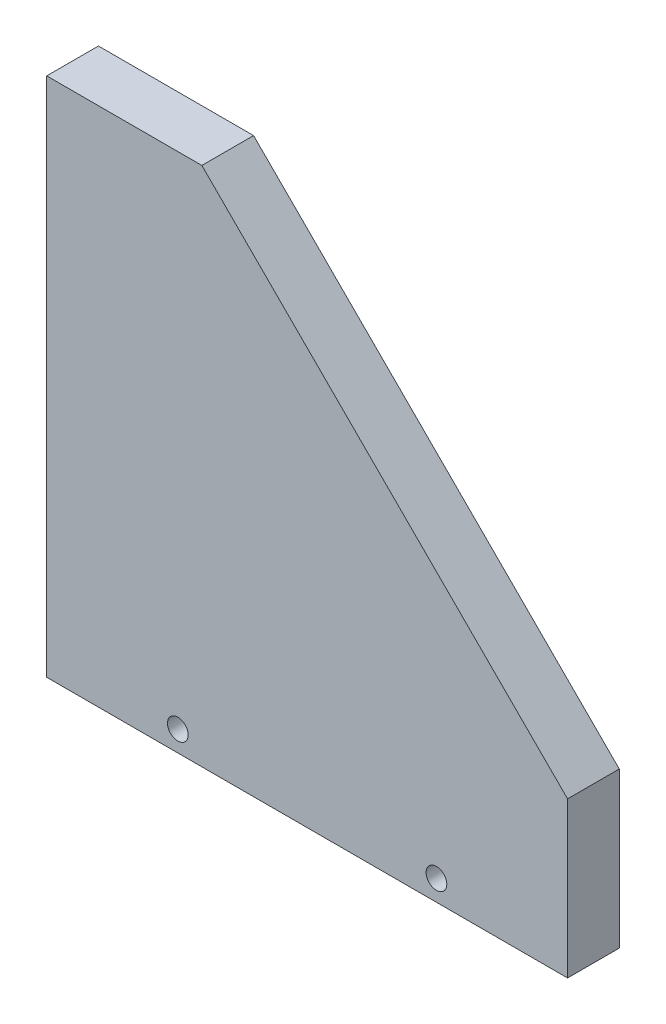
ISO-10303-21;
HEADER;
FILE_DESCRIPTION(('STEP AP214'),'2;1');
FILE_NAME('part.step','',(''),(''),'','','');
FILE_SCHEMA(('AUTOMOTIVE_DESIGN { 1 0 10303 214 1 1 1 1 }'));
ENDSEC;
DATA;
#1=APPLICATION_CONTEXT('core data for automotive mechanical design processes');
#2=APPLICATION_PROTOCOL_DEFINITION('international standard','automotive_design',2000,#1);
#3=PRODUCT_CONTEXT('',#1,'mechanical');
#4=PRODUCT('Part','Part','',(#3));
#5=PRODUCT_RELATED_PRODUCT_CATEGORY('part','',(#4));
#6=PRODUCT_DEFINITION_FORMATION('','',#4);
#7=PRODUCT_DEFINITION_CONTEXT('part definition',#1,'design');
#8=PRODUCT_DEFINITION('design','',#6,#7);
#9=PRODUCT_DEFINITION_SHAPE('','',#8);
#10=(LENGTH_UNIT() NAMED_UNIT(*) SI_UNIT(.MILLI.,.METRE.));
#11=(NAMED_UNIT(*) PLANE_ANGLE_UNIT() SI_UNIT($,.RADIAN.));
#12=(NAMED_UNIT(*) SI_UNIT($,.STERADIAN.) SOLID_ANGLE_UNIT());
#13=UNCERTAINTY_MEASURE_WITH_UNIT(LENGTH_MEASURE(1.E-05),#10,'distance_accuracy_value','');
#14=(GEOMETRIC_REPRESENTATION_CONTEXT(3) GLOBAL_UNCERTAINTY_ASSIGNED_CONTEXT((#13)) GLOBAL_UNIT_ASSIGNED_CONTEXT((#10,
#11,#12)) REPRESENTATION_CONTEXT('',''));
#15=CARTESIAN_POINT('',(0.,0.,0.));
#16=DIRECTION('',(0.,0.,1.));
#17=DIRECTION('',(1.,0.,0.));
#18=AXIS2_PLACEMENT_3D('',#15,#16,#17);
#19=CARTESIAN_POINT('',(100.710678118656,0.,10.));
#20=DIRECTION('',(0.,1.,0.));
#21=DIRECTION('',(-1.,0.,0.));
#22=AXIS2_PLACEMENT_3D('',#19,#20,#21);
#23=PLANE('',#22);
#24=DIRECTION('',(1.,0.,0.));
#25=VECTOR('',#24,1.);
#26=CARTESIAN_POINT('',(100.710678118656,0.,0.));
#27=LINE('',#26,#25);
#28=CARTESIAN_POINT('',(0.,0.,0.));
#29=VERTEX_POINT('',#28);
#30=CARTESIAN_POINT('',(100.710678118656,0.,0.));
#31=VERTEX_POINT('',#30);
#32=EDGE_CURVE('E107',#29,#31,#27,.T.);
#33=ORIENTED_EDGE('',*,*,#32,.T.);
#34=DIRECTION('',(0.,0.,-1.));
#35=VECTOR('',#34,1.);
#36=CARTESIAN_POINT('',(100.710678118656,0.,10.));
#37=LINE('',#36,#35);
#38=CARTESIAN_POINT('',(100.710678118656,0.,10.));
#39=VERTEX_POINT('',#38);
#40=EDGE_CURVE('E11',#39,#31,#37,.T.);
#41=ORIENTED_EDGE('',*,*,#40,.F.);
#42=DIRECTION('',(1.,0.,0.));
#43=VECTOR('',#42,1.);
#44=CARTESIAN_POINT('',(100.710678118656,0.,10.));
#45=LINE('',#44,#43);
#46=CARTESIAN_POINT('',(0.,0.,10.));
#47=VERTEX_POINT('',#46);
#48=EDGE_CURVE('E116',#47,#39,#45,.T.);
#49=ORIENTED_EDGE('',*,*,#48,.F.);
#50=DIRECTION('',(0.,0.,-1.));
#51=VECTOR('',#50,1.);
#52=CARTESIAN_POINT('',(0.,0.,10.));
#53=LINE('',#52,#51);
#54=EDGE_CURVE('E103',#47,#29,#53,.T.);
#55=ORIENTED_EDGE('',*,*,#54,.T.);
#56=EDGE_LOOP('',(#33,#41,#49,#55));
#57=FACE_BOUND('',#56,.T.);
#58=ADVANCED_FACE('F33',(#57),#23,.F.);
#59=CARTESIAN_POINT('',(100.710678118656,30.,10.));
#60=DIRECTION('',(-1.,0.,0.));
#61=DIRECTION('',(0.,0.,1.));
#62=AXIS2_PLACEMENT_3D('',#59,#60,#61);
#63=PLANE('',#62);
#64=DIRECTION('',(0.,1.,0.));
#65=VECTOR('',#64,1.);
#66=CARTESIAN_POINT('',(100.710678118656,30.,0.));
#67=LINE('',#66,#65);
#68=CARTESIAN_POINT('',(100.710678118656,30.,0.));
#69=VERTEX_POINT('',#68);
#70=EDGE_CURVE('E110',#31,#69,#67,.T.);
#71=ORIENTED_EDGE('',*,*,#70,.T.);
#72=DIRECTION('',(0.,0.,-1.));
#73=VECTOR('',#72,1.);
#74=CARTESIAN_POINT('',(100.710678118656,30.,10.));
#75=LINE('',#74,#73);
#76=CARTESIAN_POINT('',(100.710678118656,30.,10.));
#77=VERTEX_POINT('',#76);
#78=EDGE_CURVE('E41',#77,#69,#75,.T.);
#79=ORIENTED_EDGE('',*,*,#78,.F.);
#80=DIRECTION('',(0.,1.,0.));
#81=VECTOR('',#80,1.);
#82=CARTESIAN_POINT('',(100.710678118656,30.,10.));
#83=LINE('',#82,#81);
#84=EDGE_CURVE('E83',#39,#77,#83,.T.);
#85=ORIENTED_EDGE('',*,*,#84,.F.);
#86=ORIENTED_EDGE('',*,*,#40,.T.);
#87=EDGE_LOOP('',(#71,#79,#85,#86));
#88=FACE_BOUND('',#87,.T.);
#89=ADVANCED_FACE('F137',(#88),#63,.F.);
#90=CARTESIAN_POINT('',(30.,100.710678118654,10.));
#91=DIRECTION('',(-0.707106781186536,-0.707106781186559,0.));
#92=DIRECTION('',(0.707106781186559,-0.707106781186536,0.));
#93=AXIS2_PLACEMENT_3D('',#90,#91,#92);
#94=PLANE('',#93);
#95=DIRECTION('',(-0.707106781186559,0.707106781186536,0.));
#96=VECTOR('',#95,1.);
#97=CARTESIAN_POINT('',(30.,100.710678118654,0.));
#98=LINE('',#97,#96);
#99=CARTESIAN_POINT('',(30.,100.710678118654,0.));
#100=VERTEX_POINT('',#99);
#101=EDGE_CURVE('E98',#69,#100,#98,.T.);
#102=ORIENTED_EDGE('',*,*,#101,.T.);
#103=DIRECTION('',(0.,0.,-1.));
#104=VECTOR('',#103,1.);
#105=CARTESIAN_POINT('',(30.,100.710678118654,10.));
#106=LINE('',#105,#104);
#107=CARTESIAN_POINT('',(30.,100.710678118654,10.));
#108=VERTEX_POINT('',#107);
#109=EDGE_CURVE('E95',#108,#100,#106,.T.);
#110=ORIENTED_EDGE('',*,*,#109,.F.);
#111=DIRECTION('',(-0.707106781186559,0.707106781186536,0.));
#112=VECTOR('',#111,1.);
#113=CARTESIAN_POINT('',(30.,100.710678118654,10.));
#114=LINE('',#113,#112);
#115=EDGE_CURVE('E87',#77,#108,#114,.T.);
#116=ORIENTED_EDGE('',*,*,#115,.F.);
#117=ORIENTED_EDGE('',*,*,#78,.T.);
#118=EDGE_LOOP('',(#102,#110,#116,#117));
#119=FACE_BOUND('',#118,.T.);
#120=ADVANCED_FACE('F96',(#119),#94,.F.);
#121=CARTESIAN_POINT('',(0.,100.710678118654,10.));
#122=DIRECTION('',(0.,-1.,0.));
#123=DIRECTION('',(0.,0.,-1.));
#124=AXIS2_PLACEMENT_3D('',#121,#122,#123);
#125=PLANE('',#124);
#126=DIRECTION('',(-1.,0.,0.));
#127=VECTOR('',#126,1.);
#128=CARTESIAN_POINT('',(0.,100.710678118654,0.));
#129=LINE('',#128,#127);
#130=CARTESIAN_POINT('',(0.,100.710678118654,0.));
#131=VERTEX_POINT('',#130);
#132=EDGE_CURVE('E69',#100,#131,#129,.T.);
#133=ORIENTED_EDGE('',*,*,#132,.T.);
#134=DIRECTION('',(0.,0.,-1.));
#135=VECTOR('',#134,1.);
#136=CARTESIAN_POINT('',(0.,100.710678118654,10.));
#137=LINE('',#136,#135);
#138=CARTESIAN_POINT('',(0.,100.710678118654,10.));
#139=VERTEX_POINT('',#138);
#140=EDGE_CURVE('E99',#139,#131,#137,.T.);
#141=ORIENTED_EDGE('',*,*,#140,.F.);
#142=DIRECTION('',(-1.,0.,0.));
#143=VECTOR('',#142,1.);
#144=CARTESIAN_POINT('',(0.,100.710678118654,10.));
#145=LINE('',#144,#143);
#146=EDGE_CURVE('E91',#108,#139,#145,.T.);
#147=ORIENTED_EDGE('',*,*,#146,.F.);
#148=ORIENTED_EDGE('',*,*,#109,.T.);
#149=EDGE_LOOP('',(#133,#141,#147,#148));
#150=FACE_BOUND('',#149,.T.);
#151=ADVANCED_FACE('F101',(#150),#125,.F.);
#152=CARTESIAN_POINT('',(0.,0.,10.));
#153=DIRECTION('',(1.,0.,0.));
#154=DIRECTION('',(0.,1.,0.));
#155=AXIS2_PLACEMENT_3D('',#152,#153,#154);
#156=PLANE('',#155);
#157=DIRECTION('',(0.,-1.,0.));
#158=VECTOR('',#157,1.);
#159=CARTESIAN_POINT('',(0.,0.,0.));
#160=LINE('',#159,#158);
#161=EDGE_CURVE('E75',#131,#29,#160,.T.);
#162=ORIENTED_EDGE('',*,*,#161,.T.);
#163=ORIENTED_EDGE('',*,*,#54,.F.);
#164=DIRECTION('',(0.,-1.,0.));
#165=VECTOR('',#164,1.);
#166=CARTESIAN_POINT('',(0.,0.,10.));
#167=LINE('',#166,#165);
#168=EDGE_CURVE('E49',#139,#47,#167,.T.);
#169=ORIENTED_EDGE('',*,*,#168,.F.);
#170=ORIENTED_EDGE('',*,*,#140,.T.);
#171=EDGE_LOOP('',(#162,#163,#169,#170));
#172=FACE_BOUND('',#171,.T.);
#173=ADVANCED_FACE('F124',(#172),#156,.F.);
#174=CARTESIAN_POINT('',(0.,0.,10.));
#175=DIRECTION('',(0.,0.,-1.));
#176=DIRECTION('',(-1.,0.,0.));
#177=AXIS2_PLACEMENT_3D('',#174,#175,#176);
#178=PLANE('',#177);
#179=CARTESIAN_POINT('',(25.3553390593279,4.00000000000001,10.));
#180=DIRECTION('',(0.,0.,-1.));
#181=DIRECTION('',(-1.,0.,0.));
#182=AXIS2_PLACEMENT_3D('',#179,#180,#181);
#183=CIRCLE('',#182,2.);
#184=CARTESIAN_POINT('',(23.3553390593279,4.00000000000001,10.));
#185=VERTEX_POINT('',#184);
#186=EDGE_CURVE('E111',#185,#185,#183,.T.);
#187=ORIENTED_EDGE('',*,*,#186,.T.);
#188=EDGE_LOOP('',(#187));
#189=FACE_BOUND('',#188,.T.);
#190=CARTESIAN_POINT('',(75.3553390593279,4.00000000000002,10.));
#191=DIRECTION('',(0.,0.,-1.));
#192=DIRECTION('',(-1.,0.,0.));
#193=AXIS2_PLACEMENT_3D('',#190,#191,#192);
#194=CIRCLE('',#193,2.);
#195=CARTESIAN_POINT('',(73.3553390593279,4.00000000000002,10.));
#196=VERTEX_POINT('',#195);
#197=EDGE_CURVE('E194',#196,#196,#194,.T.);
#198=ORIENTED_EDGE('',*,*,#197,.T.);
#199=EDGE_LOOP('',(#198));
#200=FACE_BOUND('',#199,.T.);
#201=ORIENTED_EDGE('',*,*,#48,.T.);
#202=ORIENTED_EDGE('',*,*,#84,.T.);
#203=ORIENTED_EDGE('',*,*,#115,.T.);
#204=ORIENTED_EDGE('',*,*,#146,.T.);
#205=ORIENTED_EDGE('',*,*,#168,.T.);
#206=EDGE_LOOP('',(#201,#202,#203,#204,#205));
#207=FACE_BOUND('',#206,.T.);
#208=ADVANCED_FACE('F89',(#189,#200,#207),#178,.F.);
#209=CARTESIAN_POINT('',(0.,0.,0.));
#210=DIRECTION('',(0.,0.,-1.));
#211=DIRECTION('',(-1.,0.,0.));
#212=AXIS2_PLACEMENT_3D('',#209,#210,#211);
#213=PLANE('',#212);
#214=CARTESIAN_POINT('',(25.3553390593279,4.00000000000001,0.));
#215=DIRECTION('',(0.,0.,1.));
#216=DIRECTION('',(1.,0.,0.));
#217=AXIS2_PLACEMENT_3D('',#214,#215,#216);
#218=CIRCLE('',#217,2.);
#219=CARTESIAN_POINT('',(27.3553390593279,4.00000000000001,0.));
#220=VERTEX_POINT('',#219);
#221=EDGE_CURVE('E191',#220,#220,#218,.T.);
#222=ORIENTED_EDGE('',*,*,#221,.T.);
#223=EDGE_LOOP('',(#222));
#224=FACE_BOUND('',#223,.T.);
#225=CARTESIAN_POINT('',(75.3553390593279,4.00000000000002,0.));
#226=DIRECTION('',(0.,0.,1.));
#227=DIRECTION('',(-1.,0.,0.));
#228=AXIS2_PLACEMENT_3D('',#225,#226,#227);
#229=CIRCLE('',#228,2.);
#230=CARTESIAN_POINT('',(73.3553390593279,4.00000000000002,0.));
#231=VERTEX_POINT('',#230);
#232=EDGE_CURVE('E200',#231,#231,#229,.T.);
#233=ORIENTED_EDGE('',*,*,#232,.T.);
#234=EDGE_LOOP('',(#233));
#235=FACE_BOUND('',#234,.T.);
#236=ORIENTED_EDGE('',*,*,#32,.F.);
#237=ORIENTED_EDGE('',*,*,#161,.F.);
#238=ORIENTED_EDGE('',*,*,#132,.F.);
#239=ORIENTED_EDGE('',*,*,#101,.F.);
#240=ORIENTED_EDGE('',*,*,#70,.F.);
#241=EDGE_LOOP('',(#236,#237,#238,#239,#240));
#242=FACE_BOUND('',#241,.T.);
#243=ADVANCED_FACE('F120',(#224,#235,#242),#213,.T.);
#244=CARTESIAN_POINT('',(75.3553390593279,4.00000000000002,0.));
#245=DIRECTION('',(0.,0.,1.));
#246=DIRECTION('',(1.,0.,0.));
#247=AXIS2_PLACEMENT_3D('',#244,#245,#246);
#248=CYLINDRICAL_SURFACE('',#247,2.);
#249=ORIENTED_EDGE('',*,*,#232,.F.);
#250=EDGE_LOOP('',(#249));
#251=FACE_BOUND('',#250,.T.);
#252=ORIENTED_EDGE('',*,*,#197,.F.);
#253=EDGE_LOOP('',(#252));
#254=FACE_BOUND('',#253,.T.);
#255=ADVANCED_FACE('F166',(#251,#254),#248,.F.);
#256=CARTESIAN_POINT('',(25.3553390593279,4.00000000000001,0.));
#257=DIRECTION('',(0.,0.,1.));
#258=DIRECTION('',(1.,0.,0.));
#259=AXIS2_PLACEMENT_3D('',#256,#257,#258);
#260=CYLINDRICAL_SURFACE('',#259,2.);
#261=ORIENTED_EDGE('',*,*,#221,.F.);
#262=EDGE_LOOP('',(#261));
#263=FACE_BOUND('',#262,.T.);
#264=ORIENTED_EDGE('',*,*,#186,.F.);
#265=EDGE_LOOP('',(#264));
#266=FACE_BOUND('',#265,.T.);
#267=ADVANCED_FACE('F174',(#263,#266),#260,.F.);
#268=CLOSED_SHELL('',(#58,#89,#120,#151,#173,#208,#243,#255,#267));
#269=MANIFOLD_SOLID_BREP('B2',#268);
#270=ADVANCED_BREP_SHAPE_REPRESENTATION('',(#18,#269),#14);
#271=SHAPE_DEFINITION_REPRESENTATION(#9,#270);
ENDSEC;
END-ISO-10303-21;
